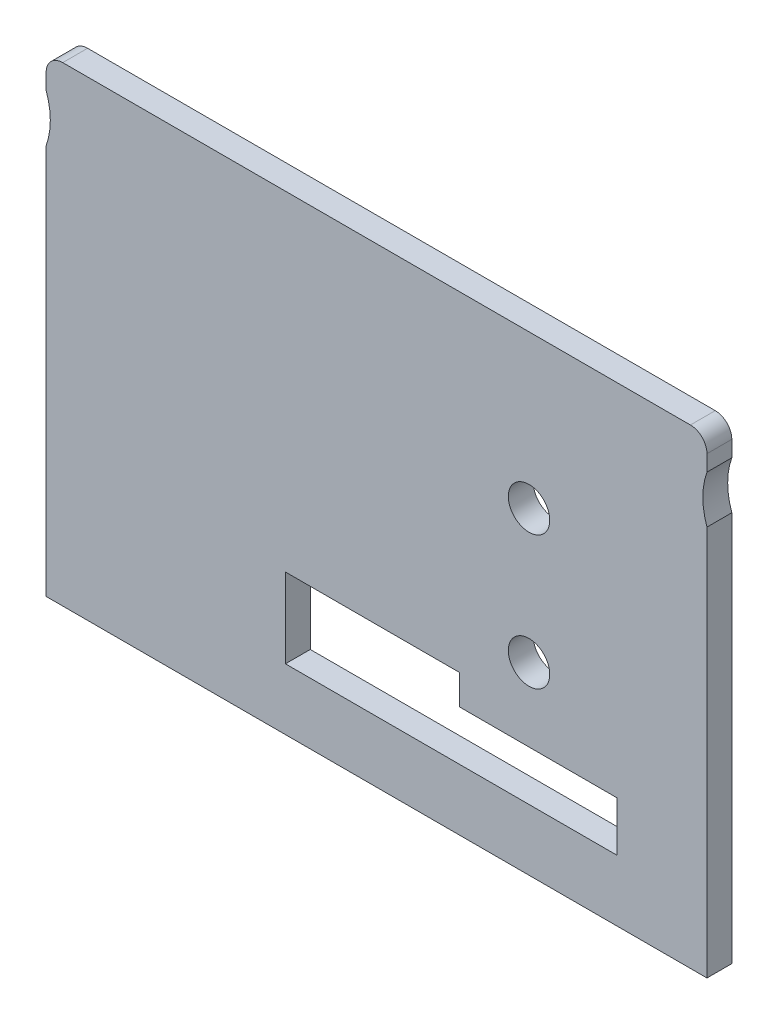
ISO-10303-21;
HEADER;
FILE_DESCRIPTION(('STEP AP214'),'2;1');
FILE_NAME('part.step','',(''),(''),'','','');
FILE_SCHEMA(('AUTOMOTIVE_DESIGN { 1 0 10303 214 1 1 1 1 }'));
ENDSEC;
DATA;
#1=APPLICATION_CONTEXT('core data for automotive mechanical design processes');
#2=APPLICATION_PROTOCOL_DEFINITION('international standard','automotive_design',2000,#1);
#3=PRODUCT_CONTEXT('',#1,'mechanical');
#4=PRODUCT('Part','Part','',(#3));
#5=PRODUCT_RELATED_PRODUCT_CATEGORY('part','',(#4));
#6=PRODUCT_DEFINITION_FORMATION('','',#4);
#7=PRODUCT_DEFINITION_CONTEXT('part definition',#1,'design');
#8=PRODUCT_DEFINITION('design','',#6,#7);
#9=PRODUCT_DEFINITION_SHAPE('','',#8);
#10=(LENGTH_UNIT() NAMED_UNIT(*) SI_UNIT(.MILLI.,.METRE.));
#11=(NAMED_UNIT(*) PLANE_ANGLE_UNIT() SI_UNIT($,.RADIAN.));
#12=(NAMED_UNIT(*) SI_UNIT($,.STERADIAN.) SOLID_ANGLE_UNIT());
#13=UNCERTAINTY_MEASURE_WITH_UNIT(LENGTH_MEASURE(1.E-05),#10,'distance_accuracy_value','');
#14=(GEOMETRIC_REPRESENTATION_CONTEXT(3) GLOBAL_UNCERTAINTY_ASSIGNED_CONTEXT((#13)) GLOBAL_UNIT_ASSIGNED_CONTEXT((#10,
#11,#12)) REPRESENTATION_CONTEXT('',''));
#15=CARTESIAN_POINT('',(0.,0.,0.));
#16=DIRECTION('',(0.,0.,1.));
#17=DIRECTION('',(1.,0.,0.));
#18=AXIS2_PLACEMENT_3D('',#15,#16,#17);
#19=CARTESIAN_POINT('',(79.875,56.8,0.));
#20=DIRECTION('',(-1.,0.,0.));
#21=DIRECTION('',(0.,-1.,0.));
#22=AXIS2_PLACEMENT_3D('',#19,#20,#21);
#23=PLANE('',#22);
#24=DIRECTION('',(0.,-1.,0.));
#25=VECTOR('',#24,1.);
#26=CARTESIAN_POINT('',(79.875,56.8,0.));
#27=LINE('',#26,#25);
#28=CARTESIAN_POINT('',(79.875,47.127718676731,0.));
#29=VERTEX_POINT('',#28);
#30=CARTESIAN_POINT('',(79.875,0.,0.));
#31=VERTEX_POINT('',#30);
#32=EDGE_CURVE('E188',#29,#31,#27,.T.);
#33=ORIENTED_EDGE('',*,*,#32,.F.);
#34=DIRECTION('',(0.,0.,1.));
#35=VECTOR('',#34,1.);
#36=CARTESIAN_POINT('',(79.875,47.127718676731,0.));
#37=LINE('',#36,#35);
#38=CARTESIAN_POINT('',(79.875,47.127718676731,3.));
#39=VERTEX_POINT('',#38);
#40=EDGE_CURVE('E262',#29,#39,#37,.T.);
#41=ORIENTED_EDGE('',*,*,#40,.T.);
#42=DIRECTION('',(0.,-1.,0.));
#43=VECTOR('',#42,1.);
#44=CARTESIAN_POINT('',(79.875,56.8,3.));
#45=LINE('',#44,#43);
#46=CARTESIAN_POINT('',(79.875,0.,3.));
#47=VERTEX_POINT('',#46);
#48=EDGE_CURVE('E190',#39,#47,#45,.T.);
#49=ORIENTED_EDGE('',*,*,#48,.T.);
#50=DIRECTION('',(0.,0.,1.));
#51=VECTOR('',#50,1.);
#52=CARTESIAN_POINT('',(79.875,0.,0.));
#53=LINE('',#52,#51);
#54=EDGE_CURVE('E175',#31,#47,#53,.T.);
#55=ORIENTED_EDGE('',*,*,#54,.F.);
#56=EDGE_LOOP('',(#33,#41,#49,#55));
#57=FACE_BOUND('',#56,.T.);
#58=ADVANCED_FACE('F36',(#57),#23,.F.);
#59=CARTESIAN_POINT('',(0.125,56.8,0.));
#60=DIRECTION('',(1.,0.,0.));
#61=DIRECTION('',(0.,1.,0.));
#62=AXIS2_PLACEMENT_3D('',#59,#60,#61);
#63=PLANE('',#62);
#64=DIRECTION('',(0.,1.,0.));
#65=VECTOR('',#64,1.);
#66=CARTESIAN_POINT('',(0.125,56.8,3.));
#67=LINE('',#66,#65);
#68=CARTESIAN_POINT('',(0.125,52.872281323269,3.));
#69=VERTEX_POINT('',#68);
#70=CARTESIAN_POINT('',(0.125,54.8,3.));
#71=VERTEX_POINT('',#70);
#72=EDGE_CURVE('E166',#69,#71,#67,.T.);
#73=ORIENTED_EDGE('',*,*,#72,.T.);
#74=DIRECTION('',(0.,0.,1.));
#75=VECTOR('',#74,1.);
#76=CARTESIAN_POINT('',(0.125,54.8,0.));
#77=LINE('',#76,#75);
#78=CARTESIAN_POINT('',(0.125,54.8,0.));
#79=VERTEX_POINT('',#78);
#80=EDGE_CURVE('E59',#71,#79,#77,.F.);
#81=ORIENTED_EDGE('',*,*,#80,.T.);
#82=DIRECTION('',(0.,1.,0.));
#83=VECTOR('',#82,1.);
#84=CARTESIAN_POINT('',(0.125,56.8,0.));
#85=LINE('',#84,#83);
#86=CARTESIAN_POINT('',(0.125,52.872281323269,0.));
#87=VERTEX_POINT('',#86);
#88=EDGE_CURVE('E167',#87,#79,#85,.T.);
#89=ORIENTED_EDGE('',*,*,#88,.F.);
#90=DIRECTION('',(0.,0.,1.));
#91=VECTOR('',#90,1.);
#92=CARTESIAN_POINT('',(0.125,52.872281323269,0.));
#93=LINE('',#92,#91);
#94=EDGE_CURVE('E154',#87,#69,#93,.T.);
#95=ORIENTED_EDGE('',*,*,#94,.T.);
#96=EDGE_LOOP('',(#73,#81,#89,#95));
#97=FACE_BOUND('',#96,.T.);
#98=ADVANCED_FACE('F165',(#97),#63,.F.);
#99=CARTESIAN_POINT('',(0.,0.,3.));
#100=DIRECTION('',(0.,0.,-1.));
#101=DIRECTION('',(-1.,0.,0.));
#102=AXIS2_PLACEMENT_3D('',#99,#100,#101);
#103=PLANE('',#102);
#104=CARTESIAN_POINT('',(58.4,22.25,3.));
#105=DIRECTION('',(0.,0.,1.));
#106=DIRECTION('',(1.,0.,0.));
#107=AXIS2_PLACEMENT_3D('',#104,#105,#106);
#108=CIRCLE('',#107,2.5);
#109=CARTESIAN_POINT('',(60.9,22.25,3.));
#110=VERTEX_POINT('',#109);
#111=EDGE_CURVE('E237',#110,#110,#108,.T.);
#112=ORIENTED_EDGE('',*,*,#111,.F.);
#113=EDGE_LOOP('',(#112));
#114=FACE_BOUND('',#113,.T.);
#115=CARTESIAN_POINT('',(58.4,38.35,3.));
#116=DIRECTION('',(0.,0.,1.));
#117=DIRECTION('',(1.,0.,0.));
#118=AXIS2_PLACEMENT_3D('',#115,#116,#117);
#119=CIRCLE('',#118,2.5);
#120=CARTESIAN_POINT('',(60.9,38.35,3.));
#121=VERTEX_POINT('',#120);
#122=EDGE_CURVE('E243',#121,#121,#119,.T.);
#123=ORIENTED_EDGE('',*,*,#122,.F.);
#124=EDGE_LOOP('',(#123));
#125=FACE_BOUND('',#124,.T.);
#126=DIRECTION('',(-1.,0.,0.));
#127=VECTOR('',#126,1.);
#128=CARTESIAN_POINT('',(0.,56.8,3.));
#129=LINE('',#128,#127);
#130=CARTESIAN_POINT('',(77.875,56.8,3.));
#131=VERTEX_POINT('',#130);
#132=CARTESIAN_POINT('',(2.125,56.8,3.));
#133=VERTEX_POINT('',#132);
#134=EDGE_CURVE('E252',#131,#133,#129,.T.);
#135=ORIENTED_EDGE('',*,*,#134,.T.);
#136=CARTESIAN_POINT('',(2.125,54.8,3.));
#137=DIRECTION('',(0.,0.,-1.));
#138=DIRECTION('',(-1.,0.,0.));
#139=AXIS2_PLACEMENT_3D('',#136,#137,#138);
#140=CIRCLE('',#139,2.);
#141=EDGE_CURVE('E173',#133,#71,#140,.F.);
#142=ORIENTED_EDGE('',*,*,#141,.T.);
#143=ORIENTED_EDGE('',*,*,#72,.F.);
#144=CARTESIAN_POINT('',(-7.87499999999999,50.,3.));
#145=DIRECTION('',(0.,0.,1.));
#146=DIRECTION('',(1.,0.,0.));
#147=AXIS2_PLACEMENT_3D('',#144,#145,#146);
#148=CIRCLE('',#147,8.5);
#149=CARTESIAN_POINT('',(0.125,47.127718676731,3.));
#150=VERTEX_POINT('',#149);
#151=EDGE_CURVE('E151',#150,#69,#148,.T.);
#152=ORIENTED_EDGE('',*,*,#151,.F.);
#153=CARTESIAN_POINT('',(0.125000000000007,0.,3.));
#154=VERTEX_POINT('',#153);
#155=EDGE_CURVE('E174',#154,#150,#67,.T.);
#156=ORIENTED_EDGE('',*,*,#155,.F.);
#157=DIRECTION('',(1.,0.,0.));
#158=VECTOR('',#157,1.);
#159=CARTESIAN_POINT('',(0.,0.,3.));
#160=LINE('',#159,#158);
#161=EDGE_CURVE('E249',#154,#47,#160,.T.);
#162=ORIENTED_EDGE('',*,*,#161,.T.);
#163=ORIENTED_EDGE('',*,*,#48,.F.);
#164=CARTESIAN_POINT('',(87.875,50.,3.));
#165=DIRECTION('',(0.,0.,1.));
#166=DIRECTION('',(-1.,0.,0.));
#167=AXIS2_PLACEMENT_3D('',#164,#165,#166);
#168=CIRCLE('',#167,8.50000000000001);
#169=CARTESIAN_POINT('',(79.875,52.8722813232691,3.));
#170=VERTEX_POINT('',#169);
#171=EDGE_CURVE('E322',#170,#39,#168,.T.);
#172=ORIENTED_EDGE('',*,*,#171,.F.);
#173=CARTESIAN_POINT('',(79.875,54.8,3.));
#174=VERTEX_POINT('',#173);
#175=EDGE_CURVE('E189',#174,#170,#45,.T.);
#176=ORIENTED_EDGE('',*,*,#175,.F.);
#177=CARTESIAN_POINT('',(77.875,54.8,3.));
#178=DIRECTION('',(0.,0.,-1.));
#179=DIRECTION('',(-1.,0.,0.));
#180=AXIS2_PLACEMENT_3D('',#177,#178,#179);
#181=CIRCLE('',#180,2.);
#182=EDGE_CURVE('E270',#174,#131,#181,.F.);
#183=ORIENTED_EDGE('',*,*,#182,.T.);
#184=EDGE_LOOP('',(#135,#142,#143,#152,#156,#162,#163,#172,#176,#183));
#185=FACE_BOUND('',#184,.T.);
#186=DIRECTION('',(1.,0.,0.));
#187=VECTOR('',#186,1.);
#188=CARTESIAN_POINT('',(69.,7.39999999999994,3.));
#189=LINE('',#188,#187);
#190=CARTESIAN_POINT('',(29.,7.39999999999994,3.));
#191=VERTEX_POINT('',#190);
#192=CARTESIAN_POINT('',(69.,7.39999999999994,3.));
#193=VERTEX_POINT('',#192);
#194=EDGE_CURVE('E192',#191,#193,#189,.T.);
#195=ORIENTED_EDGE('',*,*,#194,.F.);
#196=DIRECTION('',(0.,-1.,0.));
#197=VECTOR('',#196,1.);
#198=CARTESIAN_POINT('',(29.,7.39999999999994,3.));
#199=LINE('',#198,#197);
#200=CARTESIAN_POINT('',(29.,17.,3.));
#201=VERTEX_POINT('',#200);
#202=EDGE_CURVE('E204',#201,#191,#199,.T.);
#203=ORIENTED_EDGE('',*,*,#202,.F.);
#204=DIRECTION('',(-1.,0.,0.));
#205=VECTOR('',#204,1.);
#206=CARTESIAN_POINT('',(29.,17.,3.));
#207=LINE('',#206,#205);
#208=CARTESIAN_POINT('',(50.,17.,3.));
#209=VERTEX_POINT('',#208);
#210=EDGE_CURVE('E201',#209,#201,#207,.T.);
#211=ORIENTED_EDGE('',*,*,#210,.F.);
#212=DIRECTION('',(0.,1.,0.));
#213=VECTOR('',#212,1.);
#214=CARTESIAN_POINT('',(50.,17.,3.));
#215=LINE('',#214,#213);
#216=CARTESIAN_POINT('',(50.,13.3999999999999,3.));
#217=VERTEX_POINT('',#216);
#218=EDGE_CURVE('E199',#217,#209,#215,.T.);
#219=ORIENTED_EDGE('',*,*,#218,.F.);
#220=DIRECTION('',(-1.,0.,0.));
#221=VECTOR('',#220,1.);
#222=CARTESIAN_POINT('',(50.,13.3999999999999,3.));
#223=LINE('',#222,#221);
#224=CARTESIAN_POINT('',(69.,13.3999999999999,3.));
#225=VERTEX_POINT('',#224);
#226=EDGE_CURVE('E197',#225,#217,#223,.T.);
#227=ORIENTED_EDGE('',*,*,#226,.F.);
#228=DIRECTION('',(0.,1.,0.));
#229=VECTOR('',#228,1.);
#230=CARTESIAN_POINT('',(69.,13.3999999999999,3.));
#231=LINE('',#230,#229);
#232=EDGE_CURVE('E194',#193,#225,#231,.T.);
#233=ORIENTED_EDGE('',*,*,#232,.F.);
#234=EDGE_LOOP('',(#195,#203,#211,#219,#227,#233));
#235=FACE_BOUND('',#234,.T.);
#236=ADVANCED_FACE('F171',(#114,#125,#185,#235),#103,.F.);
#237=CARTESIAN_POINT('',(0.,0.,0.));
#238=DIRECTION('',(0.,0.,-1.));
#239=DIRECTION('',(-1.,0.,0.));
#240=AXIS2_PLACEMENT_3D('',#237,#238,#239);
#241=PLANE('',#240);
#242=ORIENTED_EDGE('',*,*,#88,.T.);
#243=CARTESIAN_POINT('',(2.125,54.8,0.));
#244=DIRECTION('',(0.,0.,-1.));
#245=DIRECTION('',(-1.,0.,0.));
#246=AXIS2_PLACEMENT_3D('',#243,#244,#245);
#247=CIRCLE('',#246,2.);
#248=CARTESIAN_POINT('',(2.125,56.8,0.));
#249=VERTEX_POINT('',#248);
#250=EDGE_CURVE('E44',#79,#249,#247,.T.);
#251=ORIENTED_EDGE('',*,*,#250,.T.);
#252=DIRECTION('',(-1.,0.,0.));
#253=VECTOR('',#252,1.);
#254=CARTESIAN_POINT('',(0.,56.8,0.));
#255=LINE('',#254,#253);
#256=CARTESIAN_POINT('',(77.875,56.8,0.));
#257=VERTEX_POINT('',#256);
#258=EDGE_CURVE('E253',#257,#249,#255,.T.);
#259=ORIENTED_EDGE('',*,*,#258,.F.);
#260=CARTESIAN_POINT('',(77.875,54.8,0.));
#261=DIRECTION('',(0.,0.,-1.));
#262=DIRECTION('',(-1.,0.,0.));
#263=AXIS2_PLACEMENT_3D('',#260,#261,#262);
#264=CIRCLE('',#263,2.);
#265=CARTESIAN_POINT('',(79.875,54.8,0.));
#266=VERTEX_POINT('',#265);
#267=EDGE_CURVE('E51',#257,#266,#264,.T.);
#268=ORIENTED_EDGE('',*,*,#267,.T.);
#269=CARTESIAN_POINT('',(79.875,52.8722813232691,0.));
#270=VERTEX_POINT('',#269);
#271=EDGE_CURVE('E178',#266,#270,#27,.T.);
#272=ORIENTED_EDGE('',*,*,#271,.T.);
#273=CARTESIAN_POINT('',(87.875,50.,0.));
#274=DIRECTION('',(0.,0.,1.));
#275=DIRECTION('',(-1.,0.,0.));
#276=AXIS2_PLACEMENT_3D('',#273,#274,#275);
#277=CIRCLE('',#276,8.50000000000001);
#278=EDGE_CURVE('E163',#270,#29,#277,.T.);
#279=ORIENTED_EDGE('',*,*,#278,.T.);
#280=ORIENTED_EDGE('',*,*,#32,.T.);
#281=DIRECTION('',(1.,0.,0.));
#282=VECTOR('',#281,1.);
#283=CARTESIAN_POINT('',(0.,0.,0.));
#284=LINE('',#283,#282);
#285=CARTESIAN_POINT('',(0.125000000000007,0.,0.));
#286=VERTEX_POINT('',#285);
#287=EDGE_CURVE('E246',#286,#31,#284,.T.);
#288=ORIENTED_EDGE('',*,*,#287,.F.);
#289=CARTESIAN_POINT('',(0.125000000000001,47.127718676731,0.));
#290=VERTEX_POINT('',#289);
#291=EDGE_CURVE('E182',#286,#290,#85,.T.);
#292=ORIENTED_EDGE('',*,*,#291,.T.);
#293=CARTESIAN_POINT('',(-7.87499999999999,50.,0.));
#294=DIRECTION('',(0.,0.,1.));
#295=DIRECTION('',(1.,0.,0.));
#296=AXIS2_PLACEMENT_3D('',#293,#294,#295);
#297=CIRCLE('',#296,8.5);
#298=EDGE_CURVE('E162',#290,#87,#297,.T.);
#299=ORIENTED_EDGE('',*,*,#298,.T.);
#300=EDGE_LOOP('',(#242,#251,#259,#268,#272,#279,#280,#288,#292,#299));
#301=FACE_BOUND('',#300,.T.);
#302=CARTESIAN_POINT('',(58.4,38.35,0.));
#303=DIRECTION('',(0.,0.,1.));
#304=DIRECTION('',(1.,0.,0.));
#305=AXIS2_PLACEMENT_3D('',#302,#303,#304);
#306=CIRCLE('',#305,2.5);
#307=CARTESIAN_POINT('',(60.9,38.35,0.));
#308=VERTEX_POINT('',#307);
#309=EDGE_CURVE('E240',#308,#308,#306,.T.);
#310=ORIENTED_EDGE('',*,*,#309,.T.);
#311=EDGE_LOOP('',(#310));
#312=FACE_BOUND('',#311,.T.);
#313=CARTESIAN_POINT('',(58.4,22.25,0.));
#314=DIRECTION('',(0.,0.,1.));
#315=DIRECTION('',(1.,0.,0.));
#316=AXIS2_PLACEMENT_3D('',#313,#314,#315);
#317=CIRCLE('',#316,2.5);
#318=CARTESIAN_POINT('',(60.9,22.25,0.));
#319=VERTEX_POINT('',#318);
#320=EDGE_CURVE('E236',#319,#319,#317,.T.);
#321=ORIENTED_EDGE('',*,*,#320,.T.);
#322=EDGE_LOOP('',(#321));
#323=FACE_BOUND('',#322,.T.);
#324=DIRECTION('',(0.,-1.,0.));
#325=VECTOR('',#324,1.);
#326=CARTESIAN_POINT('',(29.,7.39999999999994,0.));
#327=LINE('',#326,#325);
#328=CARTESIAN_POINT('',(29.,17.,0.));
#329=VERTEX_POINT('',#328);
#330=CARTESIAN_POINT('',(29.,7.39999999999994,0.));
#331=VERTEX_POINT('',#330);
#332=EDGE_CURVE('E195',#329,#331,#327,.T.);
#333=ORIENTED_EDGE('',*,*,#332,.T.);
#334=DIRECTION('',(1.,0.,0.));
#335=VECTOR('',#334,1.);
#336=CARTESIAN_POINT('',(69.,7.39999999999994,0.));
#337=LINE('',#336,#335);
#338=CARTESIAN_POINT('',(69.,7.39999999999994,0.));
#339=VERTEX_POINT('',#338);
#340=EDGE_CURVE('E186',#331,#339,#337,.T.);
#341=ORIENTED_EDGE('',*,*,#340,.T.);
#342=DIRECTION('',(0.,1.,0.));
#343=VECTOR('',#342,1.);
#344=CARTESIAN_POINT('',(69.,13.3999999999999,0.));
#345=LINE('',#344,#343);
#346=CARTESIAN_POINT('',(69.,13.3999999999999,0.));
#347=VERTEX_POINT('',#346);
#348=EDGE_CURVE('E209',#339,#347,#345,.T.);
#349=ORIENTED_EDGE('',*,*,#348,.T.);
#350=DIRECTION('',(-1.,0.,0.));
#351=VECTOR('',#350,1.);
#352=CARTESIAN_POINT('',(50.,13.3999999999999,0.));
#353=LINE('',#352,#351);
#354=CARTESIAN_POINT('',(50.,13.3999999999999,0.));
#355=VERTEX_POINT('',#354);
#356=EDGE_CURVE('E212',#347,#355,#353,.T.);
#357=ORIENTED_EDGE('',*,*,#356,.T.);
#358=DIRECTION('',(0.,1.,0.));
#359=VECTOR('',#358,1.);
#360=CARTESIAN_POINT('',(50.,17.,0.));
#361=LINE('',#360,#359);
#362=CARTESIAN_POINT('',(50.,17.,0.));
#363=VERTEX_POINT('',#362);
#364=EDGE_CURVE('E215',#355,#363,#361,.T.);
#365=ORIENTED_EDGE('',*,*,#364,.T.);
#366=DIRECTION('',(-1.,0.,0.));
#367=VECTOR('',#366,1.);
#368=CARTESIAN_POINT('',(29.,17.,0.));
#369=LINE('',#368,#367);
#370=EDGE_CURVE('E218',#363,#329,#369,.T.);
#371=ORIENTED_EDGE('',*,*,#370,.T.);
#372=EDGE_LOOP('',(#333,#341,#349,#357,#365,#371));
#373=FACE_BOUND('',#372,.T.);
#374=ADVANCED_FACE('F275',(#301,#312,#323,#373),#241,.T.);
#375=CARTESIAN_POINT('',(0.,0.,3.));
#376=DIRECTION('',(0.,1.,0.));
#377=DIRECTION('',(0.,0.,1.));
#378=AXIS2_PLACEMENT_3D('',#375,#376,#377);
#379=PLANE('',#378);
#380=ORIENTED_EDGE('',*,*,#161,.F.);
#381=DIRECTION('',(0.,0.,1.));
#382=VECTOR('',#381,1.);
#383=CARTESIAN_POINT('',(0.125000000000007,0.,0.));
#384=LINE('',#383,#382);
#385=EDGE_CURVE('E184',#286,#154,#384,.T.);
#386=ORIENTED_EDGE('',*,*,#385,.F.);
#387=ORIENTED_EDGE('',*,*,#287,.T.);
#388=ORIENTED_EDGE('',*,*,#54,.T.);
#389=EDGE_LOOP('',(#380,#386,#387,#388));
#390=FACE_BOUND('',#389,.T.);
#391=ADVANCED_FACE('F329',(#390),#379,.F.);
#392=CARTESIAN_POINT('',(0.,56.8,3.));
#393=DIRECTION('',(0.,-1.,0.));
#394=DIRECTION('',(0.,0.,-1.));
#395=AXIS2_PLACEMENT_3D('',#392,#393,#394);
#396=PLANE('',#395);
#397=ORIENTED_EDGE('',*,*,#258,.T.);
#398=DIRECTION('',(0.,0.,1.));
#399=VECTOR('',#398,1.);
#400=CARTESIAN_POINT('',(2.125,56.8,3.));
#401=LINE('',#400,#399);
#402=EDGE_CURVE('E267',#249,#133,#401,.T.);
#403=ORIENTED_EDGE('',*,*,#402,.T.);
#404=ORIENTED_EDGE('',*,*,#134,.F.);
#405=DIRECTION('',(0.,0.,1.));
#406=VECTOR('',#405,1.);
#407=CARTESIAN_POINT('',(77.875,56.8,3.));
#408=LINE('',#407,#406);
#409=EDGE_CURVE('E265',#131,#257,#408,.F.);
#410=ORIENTED_EDGE('',*,*,#409,.T.);
#411=EDGE_LOOP('',(#397,#403,#404,#410));
#412=FACE_BOUND('',#411,.T.);
#413=ADVANCED_FACE('F280',(#412),#396,.F.);
#414=CARTESIAN_POINT('',(58.4,38.35,3.));
#415=DIRECTION('',(0.,0.,-1.));
#416=DIRECTION('',(-1.,0.,0.));
#417=AXIS2_PLACEMENT_3D('',#414,#415,#416);
#418=CYLINDRICAL_SURFACE('',#417,2.5);
#419=ORIENTED_EDGE('',*,*,#122,.T.);
#420=EDGE_LOOP('',(#419));
#421=FACE_BOUND('',#420,.T.);
#422=ORIENTED_EDGE('',*,*,#309,.F.);
#423=EDGE_LOOP('',(#422));
#424=FACE_BOUND('',#423,.T.);
#425=ADVANCED_FACE('F337',(#421,#424),#418,.F.);
#426=CARTESIAN_POINT('',(58.4,22.25,3.));
#427=DIRECTION('',(0.,0.,-1.));
#428=DIRECTION('',(-1.,0.,0.));
#429=AXIS2_PLACEMENT_3D('',#426,#427,#428);
#430=CYLINDRICAL_SURFACE('',#429,2.5);
#431=ORIENTED_EDGE('',*,*,#111,.T.);
#432=EDGE_LOOP('',(#431));
#433=FACE_BOUND('',#432,.T.);
#434=ORIENTED_EDGE('',*,*,#320,.F.);
#435=EDGE_LOOP('',(#434));
#436=FACE_BOUND('',#435,.T.);
#437=ADVANCED_FACE('F346',(#433,#436),#430,.F.);
#438=CARTESIAN_POINT('',(69.,7.39999999999994,3.));
#439=DIRECTION('',(0.,1.,0.));
#440=DIRECTION('',(-1.,0.,0.));
#441=AXIS2_PLACEMENT_3D('',#438,#439,#440);
#442=PLANE('',#441);
#443=ORIENTED_EDGE('',*,*,#340,.F.);
#444=DIRECTION('',(0.,0.,-1.));
#445=VECTOR('',#444,1.);
#446=CARTESIAN_POINT('',(29.,7.39999999999994,3.));
#447=LINE('',#446,#445);
#448=EDGE_CURVE('E206',#191,#331,#447,.T.);
#449=ORIENTED_EDGE('',*,*,#448,.F.);
#450=ORIENTED_EDGE('',*,*,#194,.T.);
#451=DIRECTION('',(0.,0.,-1.));
#452=VECTOR('',#451,1.);
#453=CARTESIAN_POINT('',(69.,7.39999999999994,3.));
#454=LINE('',#453,#452);
#455=EDGE_CURVE('E233',#193,#339,#454,.T.);
#456=ORIENTED_EDGE('',*,*,#455,.T.);
#457=EDGE_LOOP('',(#443,#449,#450,#456));
#458=FACE_BOUND('',#457,.T.);
#459=ADVANCED_FACE('F350',(#458),#442,.T.);
#460=CARTESIAN_POINT('',(69.,13.3999999999999,3.));
#461=DIRECTION('',(-1.,0.,0.));
#462=DIRECTION('',(0.,0.,1.));
#463=AXIS2_PLACEMENT_3D('',#460,#461,#462);
#464=PLANE('',#463);
#465=ORIENTED_EDGE('',*,*,#348,.F.);
#466=ORIENTED_EDGE('',*,*,#455,.F.);
#467=ORIENTED_EDGE('',*,*,#232,.T.);
#468=DIRECTION('',(0.,0.,-1.));
#469=VECTOR('',#468,1.);
#470=CARTESIAN_POINT('',(69.,13.3999999999999,3.));
#471=LINE('',#470,#469);
#472=EDGE_CURVE('E231',#225,#347,#471,.T.);
#473=ORIENTED_EDGE('',*,*,#472,.T.);
#474=EDGE_LOOP('',(#465,#466,#467,#473));
#475=FACE_BOUND('',#474,.T.);
#476=ADVANCED_FACE('F354',(#475),#464,.T.);
#477=CARTESIAN_POINT('',(50.,13.3999999999999,3.));
#478=DIRECTION('',(0.,-1.,0.));
#479=DIRECTION('',(0.,0.,-1.));
#480=AXIS2_PLACEMENT_3D('',#477,#478,#479);
#481=PLANE('',#480);
#482=ORIENTED_EDGE('',*,*,#356,.F.);
#483=ORIENTED_EDGE('',*,*,#472,.F.);
#484=ORIENTED_EDGE('',*,*,#226,.T.);
#485=DIRECTION('',(0.,0.,-1.));
#486=VECTOR('',#485,1.);
#487=CARTESIAN_POINT('',(50.,13.3999999999999,3.));
#488=LINE('',#487,#486);
#489=EDGE_CURVE('E229',#217,#355,#488,.T.);
#490=ORIENTED_EDGE('',*,*,#489,.T.);
#491=EDGE_LOOP('',(#482,#483,#484,#490));
#492=FACE_BOUND('',#491,.T.);
#493=ADVANCED_FACE('F358',(#492),#481,.T.);
#494=CARTESIAN_POINT('',(50.,17.,3.));
#495=DIRECTION('',(-1.,0.,0.));
#496=DIRECTION('',(0.,0.,1.));
#497=AXIS2_PLACEMENT_3D('',#494,#495,#496);
#498=PLANE('',#497);
#499=ORIENTED_EDGE('',*,*,#364,.F.);
#500=ORIENTED_EDGE('',*,*,#489,.F.);
#501=ORIENTED_EDGE('',*,*,#218,.T.);
#502=DIRECTION('',(0.,0.,-1.));
#503=VECTOR('',#502,1.);
#504=CARTESIAN_POINT('',(50.,17.,3.));
#505=LINE('',#504,#503);
#506=EDGE_CURVE('E227',#209,#363,#505,.T.);
#507=ORIENTED_EDGE('',*,*,#506,.T.);
#508=EDGE_LOOP('',(#499,#500,#501,#507));
#509=FACE_BOUND('',#508,.T.);
#510=ADVANCED_FACE('F362',(#509),#498,.T.);
#511=CARTESIAN_POINT('',(29.,17.,3.));
#512=DIRECTION('',(0.,-1.,0.));
#513=DIRECTION('',(0.,0.,-1.));
#514=AXIS2_PLACEMENT_3D('',#511,#512,#513);
#515=PLANE('',#514);
#516=ORIENTED_EDGE('',*,*,#370,.F.);
#517=ORIENTED_EDGE('',*,*,#506,.F.);
#518=ORIENTED_EDGE('',*,*,#210,.T.);
#519=DIRECTION('',(0.,0.,-1.));
#520=VECTOR('',#519,1.);
#521=CARTESIAN_POINT('',(29.,17.,3.));
#522=LINE('',#521,#520);
#523=EDGE_CURVE('E225',#201,#329,#522,.T.);
#524=ORIENTED_EDGE('',*,*,#523,.T.);
#525=EDGE_LOOP('',(#516,#517,#518,#524));
#526=FACE_BOUND('',#525,.T.);
#527=ADVANCED_FACE('F313',(#526),#515,.T.);
#528=CARTESIAN_POINT('',(29.,7.39999999999994,3.));
#529=DIRECTION('',(1.,0.,0.));
#530=DIRECTION('',(0.,0.,-1.));
#531=AXIS2_PLACEMENT_3D('',#528,#529,#530);
#532=PLANE('',#531);
#533=ORIENTED_EDGE('',*,*,#332,.F.);
#534=ORIENTED_EDGE('',*,*,#523,.F.);
#535=ORIENTED_EDGE('',*,*,#202,.T.);
#536=ORIENTED_EDGE('',*,*,#448,.T.);
#537=EDGE_LOOP('',(#533,#534,#535,#536));
#538=FACE_BOUND('',#537,.T.);
#539=ADVANCED_FACE('F306',(#538),#532,.T.);
#540=ORIENTED_EDGE('',*,*,#271,.F.);
#541=DIRECTION('',(0.,0.,1.));
#542=VECTOR('',#541,1.);
#543=CARTESIAN_POINT('',(79.875,54.8,0.));
#544=LINE('',#543,#542);
#545=EDGE_CURVE('E11',#266,#174,#544,.T.);
#546=ORIENTED_EDGE('',*,*,#545,.T.);
#547=ORIENTED_EDGE('',*,*,#175,.T.);
#548=DIRECTION('',(0.,0.,1.));
#549=VECTOR('',#548,1.);
#550=CARTESIAN_POINT('',(79.875,52.8722813232691,0.));
#551=LINE('',#550,#549);
#552=EDGE_CURVE('E168',#170,#270,#551,.F.);
#553=ORIENTED_EDGE('',*,*,#552,.T.);
#554=EDGE_LOOP('',(#540,#546,#547,#553));
#555=FACE_BOUND('',#554,.T.);
#556=ADVANCED_FACE('F297',(#555),#23,.F.);
#557=ORIENTED_EDGE('',*,*,#155,.T.);
#558=DIRECTION('',(0.,0.,1.));
#559=VECTOR('',#558,1.);
#560=CARTESIAN_POINT('',(0.125,47.127718676731,0.));
#561=LINE('',#560,#559);
#562=EDGE_CURVE('E157',#150,#290,#561,.F.);
#563=ORIENTED_EDGE('',*,*,#562,.T.);
#564=ORIENTED_EDGE('',*,*,#291,.F.);
#565=ORIENTED_EDGE('',*,*,#385,.T.);
#566=EDGE_LOOP('',(#557,#563,#564,#565));
#567=FACE_BOUND('',#566,.T.);
#568=ADVANCED_FACE('F302',(#567),#63,.F.);
#569=CARTESIAN_POINT('',(-7.87499999999999,50.,0.));
#570=DIRECTION('',(0.,0.,1.));
#571=DIRECTION('',(1.,0.,0.));
#572=AXIS2_PLACEMENT_3D('',#569,#570,#571);
#573=CYLINDRICAL_SURFACE('',#572,8.5);
#574=ORIENTED_EDGE('',*,*,#298,.F.);
#575=ORIENTED_EDGE('',*,*,#562,.F.);
#576=ORIENTED_EDGE('',*,*,#151,.T.);
#577=ORIENTED_EDGE('',*,*,#94,.F.);
#578=EDGE_LOOP('',(#574,#575,#576,#577));
#579=FACE_BOUND('',#578,.T.);
#580=ADVANCED_FACE('F153',(#579),#573,.F.);
#581=CARTESIAN_POINT('',(87.875,50.,0.));
#582=DIRECTION('',(0.,0.,1.));
#583=DIRECTION('',(1.,0.,0.));
#584=AXIS2_PLACEMENT_3D('',#581,#582,#583);
#585=CYLINDRICAL_SURFACE('',#584,8.50000000000001);
#586=ORIENTED_EDGE('',*,*,#278,.F.);
#587=ORIENTED_EDGE('',*,*,#552,.F.);
#588=ORIENTED_EDGE('',*,*,#171,.T.);
#589=ORIENTED_EDGE('',*,*,#40,.F.);
#590=EDGE_LOOP('',(#586,#587,#588,#589));
#591=FACE_BOUND('',#590,.T.);
#592=ADVANCED_FACE('F285',(#591),#585,.F.);
#593=CARTESIAN_POINT('',(2.125,54.8,3.));
#594=DIRECTION('',(0.,0.,1.));
#595=DIRECTION('',(1.,0.,0.));
#596=AXIS2_PLACEMENT_3D('',#593,#594,#595);
#597=CYLINDRICAL_SURFACE('',#596,2.);
#598=ORIENTED_EDGE('',*,*,#250,.F.);
#599=ORIENTED_EDGE('',*,*,#80,.F.);
#600=ORIENTED_EDGE('',*,*,#141,.F.);
#601=ORIENTED_EDGE('',*,*,#402,.F.);
#602=EDGE_LOOP('',(#598,#599,#600,#601));
#603=FACE_BOUND('',#602,.T.);
#604=ADVANCED_FACE('F283',(#603),#597,.T.);
#605=CARTESIAN_POINT('',(77.875,54.8,0.));
#606=DIRECTION('',(0.,0.,1.));
#607=DIRECTION('',(1.,0.,0.));
#608=AXIS2_PLACEMENT_3D('',#605,#606,#607);
#609=CYLINDRICAL_SURFACE('',#608,2.);
#610=ORIENTED_EDGE('',*,*,#267,.F.);
#611=ORIENTED_EDGE('',*,*,#409,.F.);
#612=ORIENTED_EDGE('',*,*,#182,.F.);
#613=ORIENTED_EDGE('',*,*,#545,.F.);
#614=EDGE_LOOP('',(#610,#611,#612,#613));
#615=FACE_BOUND('',#614,.T.);
#616=ADVANCED_FACE('F38',(#615),#609,.T.);
#617=CLOSED_SHELL('',(#58,#98,#236,#374,#391,#413,#425,#437,#459,#476,#493,#510,#527,#539,#556,
#568,#580,#592,#604,#616));
#618=MANIFOLD_SOLID_BREP('B2',#617);
#619=ADVANCED_BREP_SHAPE_REPRESENTATION('',(#18,#618),#14);
#620=SHAPE_DEFINITION_REPRESENTATION(#9,#619);
ENDSEC;
END-ISO-10303-21;
